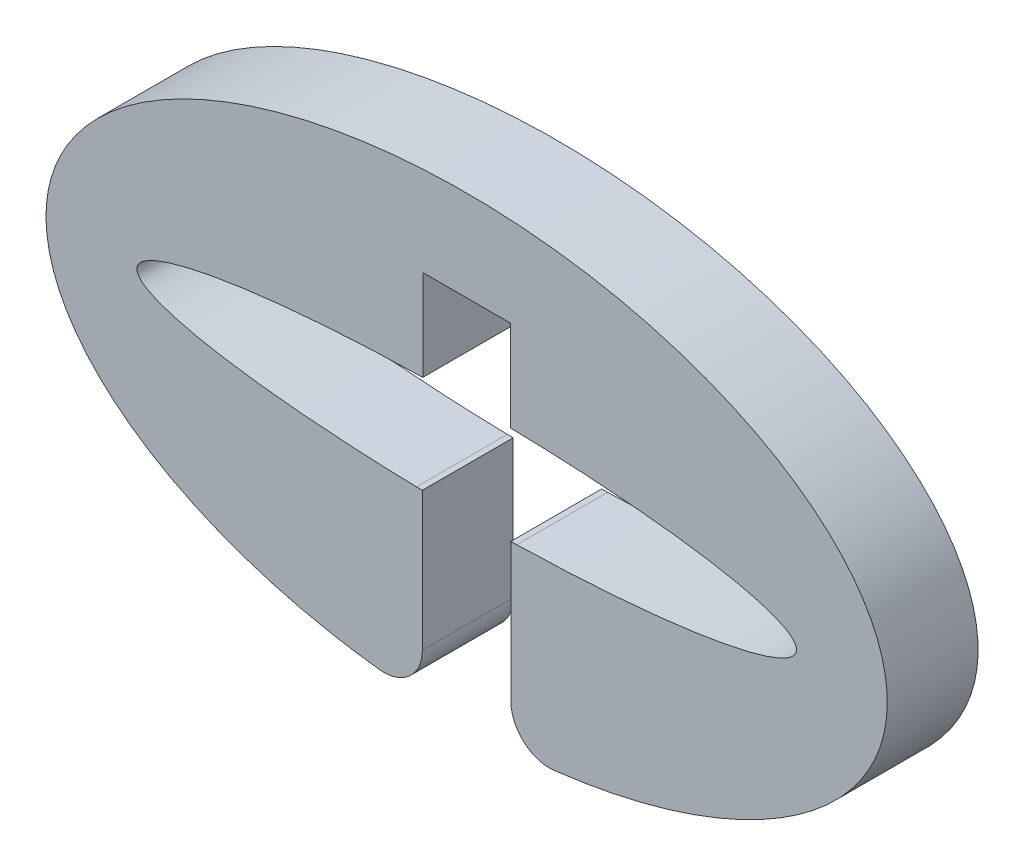
ISO-10303-21;
HEADER;
FILE_DESCRIPTION(('STEP AP214'),'2;1');
FILE_NAME('part.step','',(''),(''),'','','');
FILE_SCHEMA(('AUTOMOTIVE_DESIGN { 1 0 10303 214 1 1 1 1 }'));
ENDSEC;
DATA;
#1=APPLICATION_CONTEXT('core data for automotive mechanical design processes');
#2=APPLICATION_PROTOCOL_DEFINITION('international standard','automotive_design',2000,#1);
#3=PRODUCT_CONTEXT('',#1,'mechanical');
#4=PRODUCT('Part','Part','',(#3));
#5=PRODUCT_RELATED_PRODUCT_CATEGORY('part','',(#4));
#6=PRODUCT_DEFINITION_FORMATION('','',#4);
#7=PRODUCT_DEFINITION_CONTEXT('part definition',#1,'design');
#8=PRODUCT_DEFINITION('design','',#6,#7);
#9=PRODUCT_DEFINITION_SHAPE('','',#8);
#10=(LENGTH_UNIT() NAMED_UNIT(*) SI_UNIT(.MILLI.,.METRE.));
#11=(NAMED_UNIT(*) PLANE_ANGLE_UNIT() SI_UNIT($,.RADIAN.));
#12=(NAMED_UNIT(*) SI_UNIT($,.STERADIAN.) SOLID_ANGLE_UNIT());
#13=UNCERTAINTY_MEASURE_WITH_UNIT(LENGTH_MEASURE(1.E-05),#10,'distance_accuracy_value','');
#14=(GEOMETRIC_REPRESENTATION_CONTEXT(3) GLOBAL_UNCERTAINTY_ASSIGNED_CONTEXT((#13)) GLOBAL_UNIT_ASSIGNED_CONTEXT((#10,
#11,#12)) REPRESENTATION_CONTEXT('',''));
#15=CARTESIAN_POINT('',(0.,0.,0.));
#16=DIRECTION('',(0.,0.,1.));
#17=DIRECTION('',(1.,0.,0.));
#18=AXIS2_PLACEMENT_3D('',#15,#16,#17);
#19=CARTESIAN_POINT('',(-1.65766217696857,-1.61546146036944,3.));
#20=DIRECTION('',(0.,1.,0.));
#21=DIRECTION('',(0.,0.,1.));
#22=AXIS2_PLACEMENT_3D('',#19,#20,#21);
#23=PLANE('',#22);
#24=DIRECTION('',(0.,0.,-1.));
#25=VECTOR('',#24,1.);
#26=CARTESIAN_POINT('',(1.4625,-1.61546146036944,3.));
#27=LINE('',#26,#25);
#28=CARTESIAN_POINT('',(1.4625,-1.61546146036944,3.));
#29=VERTEX_POINT('',#28);
#30=CARTESIAN_POINT('',(1.4625,-1.61546146036944,0.));
#31=VERTEX_POINT('',#30);
#32=EDGE_CURVE('E126',#29,#31,#27,.T.);
#33=ORIENTED_EDGE('',*,*,#32,.F.);
#34=DIRECTION('',(1.,0.,0.));
#35=VECTOR('',#34,1.);
#36=CARTESIAN_POINT('',(-1.65766217696857,-1.61546146036944,3.));
#37=LINE('',#36,#35);
#38=CARTESIAN_POINT('',(1.65766217696858,-1.61546146036944,3.));
#39=VERTEX_POINT('',#38);
#40=EDGE_CURVE('E240',#29,#39,#37,.T.);
#41=ORIENTED_EDGE('',*,*,#40,.T.);
#42=DIRECTION('',(0.,0.,-1.));
#43=VECTOR('',#42,1.);
#44=CARTESIAN_POINT('',(1.65766217696858,-1.61546146036944,3.));
#45=LINE('',#44,#43);
#46=CARTESIAN_POINT('',(1.65766217696858,-1.61546146036944,0.));
#47=VERTEX_POINT('',#46);
#48=EDGE_CURVE('E146',#39,#47,#45,.T.);
#49=ORIENTED_EDGE('',*,*,#48,.T.);
#50=DIRECTION('',(1.,0.,0.));
#51=VECTOR('',#50,1.);
#52=CARTESIAN_POINT('',(-1.65766217696857,-1.61546146036944,0.));
#53=LINE('',#52,#51);
#54=EDGE_CURVE('E142',#31,#47,#53,.T.);
#55=ORIENTED_EDGE('',*,*,#54,.F.);
#56=EDGE_LOOP('',(#33,#41,#49,#55));
#57=FACE_BOUND('',#56,.T.);
#58=ADVANCED_FACE('F39',(#57),#23,.T.);
#59=CARTESIAN_POINT('',(0.,0.,3.));
#60=DIRECTION('',(0.,0.,1.));
#61=DIRECTION('',(1.,0.,0.));
#62=AXIS2_PLACEMENT_3D('',#59,#60,#61);
#63=PLANE('',#62);
#64=CARTESIAN_POINT('',(0.,0.,3.));
#65=DIRECTION('',(0.,0.,1.));
#66=DIRECTION('',(-1.,0.,0.));
#67=AXIS2_PLACEMENT_3D('',#64,#65,#66);
#68=ELLIPSE('',#67,13.8961888305808,7.62);
#69=CARTESIAN_POINT('',(2.87899614560661,-7.45466953189607,3.));
#70=VERTEX_POINT('',#69);
#71=CARTESIAN_POINT('',(-2.87899614560661,-7.45466953189607,3.));
#72=VERTEX_POINT('',#71);
#73=EDGE_CURVE('E177',#70,#72,#68,.T.);
#74=ORIENTED_EDGE('',*,*,#73,.T.);
#75=CARTESIAN_POINT('',(-2.7325,-6.19314708686293,3.));
#76=DIRECTION('',(0.,0.,1.));
#77=DIRECTION('',(1.,0.,0.));
#78=AXIS2_PLACEMENT_3D('',#75,#76,#77);
#79=CIRCLE('',#78,1.27);
#80=CARTESIAN_POINT('',(-1.4625,-6.19314708686293,3.));
#81=VERTEX_POINT('',#80);
#82=EDGE_CURVE('E252',#72,#81,#79,.T.);
#83=ORIENTED_EDGE('',*,*,#82,.T.);
#84=DIRECTION('',(0.,-1.,0.));
#85=VECTOR('',#84,1.);
#86=CARTESIAN_POINT('',(-1.4625,-11.6090873525062,3.));
#87=LINE('',#86,#85);
#88=CARTESIAN_POINT('',(-1.4625,-1.61546146036944,3.));
#89=VERTEX_POINT('',#88);
#90=EDGE_CURVE('E237',#89,#81,#87,.T.);
#91=ORIENTED_EDGE('',*,*,#90,.F.);
#92=CARTESIAN_POINT('',(-1.65766217696858,-1.61546146036944,3.));
#93=VERTEX_POINT('',#92);
#94=EDGE_CURVE('E228',#93,#89,#37,.T.);
#95=ORIENTED_EDGE('',*,*,#94,.F.);
#96=CARTESIAN_POINT('',(0.,0.,3.));
#97=DIRECTION('',(0.,0.,1.));
#98=DIRECTION('',(-1.,0.,0.));
#99=AXIS2_PLACEMENT_3D('',#96,#97,#98);
#100=ELLIPSE('',#99,10.8961888305808,1.6344866566391);
#101=CARTESIAN_POINT('',(-1.4475,1.62,3.));
#102=VERTEX_POINT('',#101);
#103=EDGE_CURVE('E233',#102,#93,#100,.T.);
#104=ORIENTED_EDGE('',*,*,#103,.F.);
#105=DIRECTION('',(0.,-1.,0.));
#106=VECTOR('',#105,1.);
#107=CARTESIAN_POINT('',(-1.4475,1.62,3.));
#108=LINE('',#107,#106);
#109=CARTESIAN_POINT('',(-1.4475,4.62000000000001,3.));
#110=VERTEX_POINT('',#109);
#111=EDGE_CURVE('E272',#110,#102,#108,.T.);
#112=ORIENTED_EDGE('',*,*,#111,.F.);
#113=DIRECTION('',(-1.,0.,0.));
#114=VECTOR('',#113,1.);
#115=CARTESIAN_POINT('',(-1.4475,4.62000000000001,3.));
#116=LINE('',#115,#114);
#117=CARTESIAN_POINT('',(1.4475,4.62,3.));
#118=VERTEX_POINT('',#117);
#119=EDGE_CURVE('E275',#118,#110,#116,.T.);
#120=ORIENTED_EDGE('',*,*,#119,.F.);
#121=DIRECTION('',(0.,1.,0.));
#122=VECTOR('',#121,1.);
#123=CARTESIAN_POINT('',(1.4475,1.62,3.));
#124=LINE('',#123,#122);
#125=CARTESIAN_POINT('',(1.4475,1.62,3.));
#126=VERTEX_POINT('',#125);
#127=EDGE_CURVE('E161',#126,#118,#124,.T.);
#128=ORIENTED_EDGE('',*,*,#127,.F.);
#129=CARTESIAN_POINT('',(0.,0.,3.));
#130=DIRECTION('',(0.,0.,1.));
#131=DIRECTION('',(-1.,0.,0.));
#132=AXIS2_PLACEMENT_3D('',#129,#130,#131);
#133=ELLIPSE('',#132,10.8961888305808,1.6344866566391);
#134=EDGE_CURVE('E164',#39,#126,#133,.T.);
#135=ORIENTED_EDGE('',*,*,#134,.F.);
#136=ORIENTED_EDGE('',*,*,#40,.F.);
#137=DIRECTION('',(0.,1.,0.));
#138=VECTOR('',#137,1.);
#139=CARTESIAN_POINT('',(1.4625,-11.6090873525062,3.));
#140=LINE('',#139,#138);
#141=CARTESIAN_POINT('',(1.4625,-6.19314708686293,3.));
#142=VERTEX_POINT('',#141);
#143=EDGE_CURVE('E131',#142,#29,#140,.T.);
#144=ORIENTED_EDGE('',*,*,#143,.F.);
#145=CARTESIAN_POINT('',(2.7325,-6.19314708686293,3.));
#146=DIRECTION('',(0.,0.,1.));
#147=DIRECTION('',(1.,0.,0.));
#148=AXIS2_PLACEMENT_3D('',#145,#146,#147);
#149=CIRCLE('',#148,1.27);
#150=EDGE_CURVE('E258',#142,#70,#149,.T.);
#151=ORIENTED_EDGE('',*,*,#150,.T.);
#152=EDGE_LOOP('',(#74,#83,#91,#95,#104,#112,#120,#128,#135,#136,#144,#151));
#153=FACE_BOUND('',#152,.T.);
#154=ADVANCED_FACE('F203',(#153),#63,.T.);
#155=CARTESIAN_POINT('',(0.,0.,0.));
#156=DIRECTION('',(0.,0.,1.));
#157=DIRECTION('',(1.,0.,0.));
#158=AXIS2_PLACEMENT_3D('',#155,#156,#157);
#159=PLANE('',#158);
#160=DIRECTION('',(0.,1.,0.));
#161=VECTOR('',#160,1.);
#162=CARTESIAN_POINT('',(-1.4625,-11.6090873525062,0.));
#163=LINE('',#162,#161);
#164=CARTESIAN_POINT('',(-1.4625,-6.19314708686293,0.));
#165=VERTEX_POINT('',#164);
#166=CARTESIAN_POINT('',(-1.4625,-1.61546146036944,0.));
#167=VERTEX_POINT('',#166);
#168=EDGE_CURVE('E144',#165,#167,#163,.T.);
#169=ORIENTED_EDGE('',*,*,#168,.F.);
#170=CARTESIAN_POINT('',(-2.7325,-6.19314708686293,0.));
#171=DIRECTION('',(0.,0.,1.));
#172=DIRECTION('',(1.,0.,0.));
#173=AXIS2_PLACEMENT_3D('',#170,#171,#172);
#174=CIRCLE('',#173,1.27);
#175=CARTESIAN_POINT('',(-2.87899614560661,-7.45466953189607,0.));
#176=VERTEX_POINT('',#175);
#177=EDGE_CURVE('E50',#165,#176,#174,.F.);
#178=ORIENTED_EDGE('',*,*,#177,.T.);
#179=CARTESIAN_POINT('',(0.,0.,0.));
#180=DIRECTION('',(0.,0.,1.));
#181=DIRECTION('',(-1.,0.,0.));
#182=AXIS2_PLACEMENT_3D('',#179,#180,#181);
#183=ELLIPSE('',#182,13.8961888305808,7.62);
#184=CARTESIAN_POINT('',(2.87899614560661,-7.45466953189607,0.));
#185=VERTEX_POINT('',#184);
#186=EDGE_CURVE('E176',#185,#176,#183,.T.);
#187=ORIENTED_EDGE('',*,*,#186,.F.);
#188=CARTESIAN_POINT('',(2.7325,-6.19314708686293,0.));
#189=DIRECTION('',(0.,0.,1.));
#190=DIRECTION('',(1.,0.,0.));
#191=AXIS2_PLACEMENT_3D('',#188,#189,#190);
#192=CIRCLE('',#191,1.27);
#193=CARTESIAN_POINT('',(1.4625,-6.19314708686293,0.));
#194=VERTEX_POINT('',#193);
#195=EDGE_CURVE('E53',#185,#194,#192,.F.);
#196=ORIENTED_EDGE('',*,*,#195,.T.);
#197=DIRECTION('',(0.,-1.,0.));
#198=VECTOR('',#197,1.);
#199=CARTESIAN_POINT('',(1.4625,-11.6090873525062,0.));
#200=LINE('',#199,#198);
#201=EDGE_CURVE('E128',#31,#194,#200,.T.);
#202=ORIENTED_EDGE('',*,*,#201,.F.);
#203=ORIENTED_EDGE('',*,*,#54,.T.);
#204=CARTESIAN_POINT('',(0.,0.,0.));
#205=DIRECTION('',(0.,0.,1.));
#206=DIRECTION('',(-1.,0.,0.));
#207=AXIS2_PLACEMENT_3D('',#204,#205,#206);
#208=ELLIPSE('',#207,10.8961888305808,1.6344866566391);
#209=CARTESIAN_POINT('',(1.4475,1.62,0.));
#210=VERTEX_POINT('',#209);
#211=EDGE_CURVE('E152',#47,#210,#208,.T.);
#212=ORIENTED_EDGE('',*,*,#211,.T.);
#213=DIRECTION('',(0.,1.,0.));
#214=VECTOR('',#213,1.);
#215=CARTESIAN_POINT('',(1.4475,1.62,0.));
#216=LINE('',#215,#214);
#217=CARTESIAN_POINT('',(1.4475,4.62,0.));
#218=VERTEX_POINT('',#217);
#219=EDGE_CURVE('E145',#210,#218,#216,.T.);
#220=ORIENTED_EDGE('',*,*,#219,.T.);
#221=DIRECTION('',(-1.,0.,0.));
#222=VECTOR('',#221,1.);
#223=CARTESIAN_POINT('',(-1.4475,4.62000000000001,0.));
#224=LINE('',#223,#222);
#225=CARTESIAN_POINT('',(-1.4475,4.62000000000001,0.));
#226=VERTEX_POINT('',#225);
#227=EDGE_CURVE('E283',#218,#226,#224,.T.);
#228=ORIENTED_EDGE('',*,*,#227,.T.);
#229=DIRECTION('',(0.,-1.,0.));
#230=VECTOR('',#229,1.);
#231=CARTESIAN_POINT('',(-1.4475,1.62,0.));
#232=LINE('',#231,#230);
#233=CARTESIAN_POINT('',(-1.4475,1.62,0.));
#234=VERTEX_POINT('',#233);
#235=EDGE_CURVE('E156',#226,#234,#232,.T.);
#236=ORIENTED_EDGE('',*,*,#235,.T.);
#237=CARTESIAN_POINT('',(0.,0.,0.));
#238=DIRECTION('',(0.,0.,1.));
#239=DIRECTION('',(-1.,0.,0.));
#240=AXIS2_PLACEMENT_3D('',#237,#238,#239);
#241=ELLIPSE('',#240,10.8961888305808,1.6344866566391);
#242=CARTESIAN_POINT('',(-1.65766217696858,-1.61546146036944,0.));
#243=VERTEX_POINT('',#242);
#244=EDGE_CURVE('E151',#234,#243,#241,.T.);
#245=ORIENTED_EDGE('',*,*,#244,.T.);
#246=EDGE_CURVE('E147',#243,#167,#53,.T.);
#247=ORIENTED_EDGE('',*,*,#246,.T.);
#248=EDGE_LOOP('',(#169,#178,#187,#196,#202,#203,#212,#220,#228,#236,#245,#247));
#249=FACE_BOUND('',#248,.T.);
#250=ADVANCED_FACE('F140',(#249),#159,.F.);
#251=DIRECTION('',(0.,0.,-1.));
#252=VECTOR('',#251,1.);
#253=SURFACE_OF_LINEAR_EXTRUSION('',#68,#252);
#254=ORIENTED_EDGE('',*,*,#186,.T.);
#255=DIRECTION('',(0.,0.,-1.));
#256=VECTOR('',#255,1.);
#257=CARTESIAN_POINT('',(-2.87899614560661,-7.45466953189607,0.));
#258=LINE('',#257,#256);
#259=EDGE_CURVE('E265',#176,#72,#258,.F.);
#260=ORIENTED_EDGE('',*,*,#259,.T.);
#261=ORIENTED_EDGE('',*,*,#73,.F.);
#262=DIRECTION('',(0.,0.,-1.));
#263=VECTOR('',#262,1.);
#264=CARTESIAN_POINT('',(2.87899614560661,-7.45466953189607,3.));
#265=LINE('',#264,#263);
#266=EDGE_CURVE('E137',#70,#185,#265,.T.);
#267=ORIENTED_EDGE('',*,*,#266,.T.);
#268=EDGE_LOOP('',(#254,#260,#261,#267));
#269=FACE_BOUND('',#268,.T.);
#270=ADVANCED_FACE('F181',(#269),#253,.F.);
#271=CARTESIAN_POINT('',(1.4475,1.62,3.));
#272=DIRECTION('',(-1.,0.,0.));
#273=DIRECTION('',(0.,0.,1.));
#274=AXIS2_PLACEMENT_3D('',#271,#272,#273);
#275=PLANE('',#274);
#276=ORIENTED_EDGE('',*,*,#219,.F.);
#277=DIRECTION('',(0.,0.,-1.));
#278=VECTOR('',#277,1.);
#279=CARTESIAN_POINT('',(1.4475,1.62,3.));
#280=LINE('',#279,#278);
#281=EDGE_CURVE('E165',#126,#210,#280,.T.);
#282=ORIENTED_EDGE('',*,*,#281,.F.);
#283=ORIENTED_EDGE('',*,*,#127,.T.);
#284=DIRECTION('',(0.,0.,-1.));
#285=VECTOR('',#284,1.);
#286=CARTESIAN_POINT('',(1.4475,4.62,3.));
#287=LINE('',#286,#285);
#288=EDGE_CURVE('E171',#118,#218,#287,.T.);
#289=ORIENTED_EDGE('',*,*,#288,.T.);
#290=EDGE_LOOP('',(#276,#282,#283,#289));
#291=FACE_BOUND('',#290,.T.);
#292=ADVANCED_FACE('F188',(#291),#275,.T.);
#293=CARTESIAN_POINT('',(-1.4475,4.62000000000001,3.));
#294=DIRECTION('',(0.,-1.,0.));
#295=DIRECTION('',(1.,0.,0.));
#296=AXIS2_PLACEMENT_3D('',#293,#294,#295);
#297=PLANE('',#296);
#298=ORIENTED_EDGE('',*,*,#227,.F.);
#299=ORIENTED_EDGE('',*,*,#288,.F.);
#300=ORIENTED_EDGE('',*,*,#119,.T.);
#301=DIRECTION('',(0.,0.,-1.));
#302=VECTOR('',#301,1.);
#303=CARTESIAN_POINT('',(-1.4475,4.62000000000001,3.));
#304=LINE('',#303,#302);
#305=EDGE_CURVE('E173',#110,#226,#304,.T.);
#306=ORIENTED_EDGE('',*,*,#305,.T.);
#307=EDGE_LOOP('',(#298,#299,#300,#306));
#308=FACE_BOUND('',#307,.T.);
#309=ADVANCED_FACE('F278',(#308),#297,.T.);
#310=CARTESIAN_POINT('',(-1.4475,1.62,3.));
#311=DIRECTION('',(1.,0.,0.));
#312=DIRECTION('',(0.,0.,-1.));
#313=AXIS2_PLACEMENT_3D('',#310,#311,#312);
#314=PLANE('',#313);
#315=ORIENTED_EDGE('',*,*,#235,.F.);
#316=ORIENTED_EDGE('',*,*,#305,.F.);
#317=ORIENTED_EDGE('',*,*,#111,.T.);
#318=DIRECTION('',(0.,0.,-1.));
#319=VECTOR('',#318,1.);
#320=CARTESIAN_POINT('',(-1.4475,1.62,3.));
#321=LINE('',#320,#319);
#322=EDGE_CURVE('E166',#102,#234,#321,.T.);
#323=ORIENTED_EDGE('',*,*,#322,.T.);
#324=EDGE_LOOP('',(#315,#316,#317,#323));
#325=FACE_BOUND('',#324,.T.);
#326=ADVANCED_FACE('F218',(#325),#314,.T.);
#327=DIRECTION('',(0.,0.,-1.));
#328=VECTOR('',#327,1.);
#329=SURFACE_OF_LINEAR_EXTRUSION('',#100,#328);
#330=ORIENTED_EDGE('',*,*,#244,.F.);
#331=ORIENTED_EDGE('',*,*,#322,.F.);
#332=ORIENTED_EDGE('',*,*,#103,.T.);
#333=DIRECTION('',(0.,0.,-1.));
#334=VECTOR('',#333,1.);
#335=CARTESIAN_POINT('',(-1.65766217696858,-1.61546146036944,3.));
#336=LINE('',#335,#334);
#337=EDGE_CURVE('E170',#93,#243,#336,.T.);
#338=ORIENTED_EDGE('',*,*,#337,.T.);
#339=EDGE_LOOP('',(#330,#331,#332,#338));
#340=FACE_BOUND('',#339,.T.);
#341=ADVANCED_FACE('F213',(#340),#329,.T.);
#342=DIRECTION('',(0.,0.,1.));
#343=VECTOR('',#342,1.);
#344=CARTESIAN_POINT('',(-1.4625,-1.61546146036944,3.));
#345=LINE('',#344,#343);
#346=EDGE_CURVE('E139',#167,#89,#345,.T.);
#347=ORIENTED_EDGE('',*,*,#346,.F.);
#348=ORIENTED_EDGE('',*,*,#246,.F.);
#349=ORIENTED_EDGE('',*,*,#337,.F.);
#350=ORIENTED_EDGE('',*,*,#94,.T.);
#351=EDGE_LOOP('',(#347,#348,#349,#350));
#352=FACE_BOUND('',#351,.T.);
#353=ADVANCED_FACE('F201',(#352),#23,.T.);
#354=DIRECTION('',(0.,0.,-1.));
#355=VECTOR('',#354,1.);
#356=SURFACE_OF_LINEAR_EXTRUSION('',#133,#355);
#357=ORIENTED_EDGE('',*,*,#211,.F.);
#358=ORIENTED_EDGE('',*,*,#48,.F.);
#359=ORIENTED_EDGE('',*,*,#134,.T.);
#360=ORIENTED_EDGE('',*,*,#281,.T.);
#361=EDGE_LOOP('',(#357,#358,#359,#360));
#362=FACE_BOUND('',#361,.T.);
#363=ADVANCED_FACE('F215',(#362),#356,.T.);
#364=CARTESIAN_POINT('',(-1.4625,-11.6090873525062,-11.1492641273238));
#365=DIRECTION('',(-1.,0.,0.));
#366=DIRECTION('',(0.,0.,1.));
#367=AXIS2_PLACEMENT_3D('',#364,#365,#366);
#368=PLANE('',#367);
#369=ORIENTED_EDGE('',*,*,#90,.T.);
#370=DIRECTION('',(0.,0.,-1.));
#371=VECTOR('',#370,1.);
#372=CARTESIAN_POINT('',(-1.4625,-6.19314708686293,-11.1492641273238));
#373=LINE('',#372,#371);
#374=EDGE_CURVE('E65',#81,#165,#373,.T.);
#375=ORIENTED_EDGE('',*,*,#374,.T.);
#376=ORIENTED_EDGE('',*,*,#168,.T.);
#377=ORIENTED_EDGE('',*,*,#346,.T.);
#378=EDGE_LOOP('',(#369,#375,#376,#377));
#379=FACE_BOUND('',#378,.T.);
#380=ADVANCED_FACE('F197',(#379),#368,.F.);
#381=CARTESIAN_POINT('',(1.4625,-11.6090873525062,-11.1492641273238));
#382=DIRECTION('',(1.,0.,0.));
#383=DIRECTION('',(0.,1.,0.));
#384=AXIS2_PLACEMENT_3D('',#381,#382,#383);
#385=PLANE('',#384);
#386=ORIENTED_EDGE('',*,*,#201,.T.);
#387=DIRECTION('',(0.,0.,-1.));
#388=VECTOR('',#387,1.);
#389=CARTESIAN_POINT('',(1.4625,-6.19314708686293,-11.1492641273238));
#390=LINE('',#389,#388);
#391=EDGE_CURVE('E11',#194,#142,#390,.F.);
#392=ORIENTED_EDGE('',*,*,#391,.T.);
#393=ORIENTED_EDGE('',*,*,#143,.T.);
#394=ORIENTED_EDGE('',*,*,#32,.T.);
#395=EDGE_LOOP('',(#386,#392,#393,#394));
#396=FACE_BOUND('',#395,.T.);
#397=ADVANCED_FACE('F129',(#396),#385,.F.);
#398=CARTESIAN_POINT('',(-2.7325,-6.19314708686293,1.5));
#399=DIRECTION('',(0.,0.,-1.));
#400=DIRECTION('',(-1.,0.,0.));
#401=AXIS2_PLACEMENT_3D('',#398,#399,#400);
#402=CYLINDRICAL_SURFACE('',#401,1.27);
#403=ORIENTED_EDGE('',*,*,#177,.F.);
#404=ORIENTED_EDGE('',*,*,#374,.F.);
#405=ORIENTED_EDGE('',*,*,#82,.F.);
#406=ORIENTED_EDGE('',*,*,#259,.F.);
#407=EDGE_LOOP('',(#403,#404,#405,#406));
#408=FACE_BOUND('',#407,.T.);
#409=ADVANCED_FACE('F187',(#408),#402,.T.);
#410=CARTESIAN_POINT('',(2.7325,-6.19314708686293,1.5));
#411=DIRECTION('',(0.,0.,-1.));
#412=DIRECTION('',(-1.,0.,0.));
#413=AXIS2_PLACEMENT_3D('',#410,#411,#412);
#414=CYLINDRICAL_SURFACE('',#413,1.27);
#415=ORIENTED_EDGE('',*,*,#150,.F.);
#416=ORIENTED_EDGE('',*,*,#391,.F.);
#417=ORIENTED_EDGE('',*,*,#195,.F.);
#418=ORIENTED_EDGE('',*,*,#266,.F.);
#419=EDGE_LOOP('',(#415,#416,#417,#418));
#420=FACE_BOUND('',#419,.T.);
#421=ADVANCED_FACE('F41',(#420),#414,.T.);
#422=CLOSED_SHELL('',(#58,#154,#250,#270,#292,#309,#326,#341,#353,#363,#380,#397,#409,#421));
#423=MANIFOLD_SOLID_BREP('B2',#422);
#424=ADVANCED_BREP_SHAPE_REPRESENTATION('',(#18,#423),#14);
#425=SHAPE_DEFINITION_REPRESENTATION(#9,#424);
ENDSEC;
END-ISO-10303-21;
